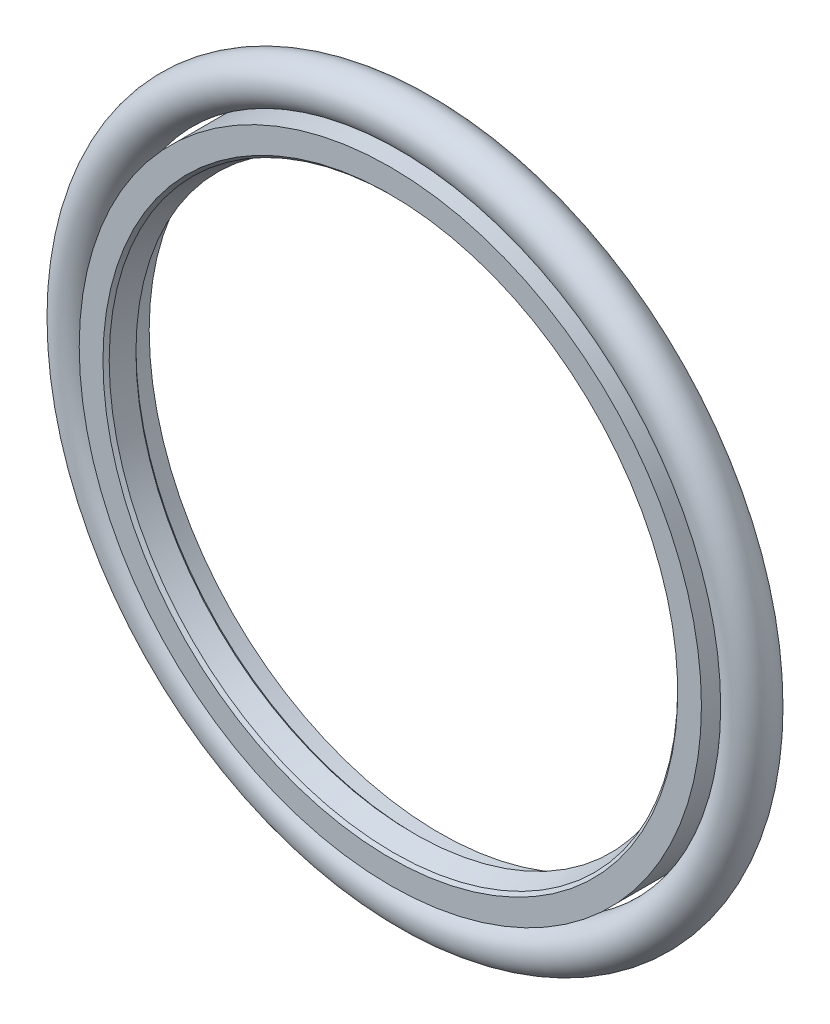
ISO-10303-21;
HEADER;
FILE_DESCRIPTION(('STEP AP214'),'2;1');
FILE_NAME('part.step','',(''),(''),'','','');
FILE_SCHEMA(('AUTOMOTIVE_DESIGN { 1 0 10303 214 1 1 1 1 }'));
ENDSEC;
DATA;
#1=APPLICATION_CONTEXT('core data for automotive mechanical design processes');
#2=APPLICATION_PROTOCOL_DEFINITION('international standard','automotive_design',2000,#1);
#3=PRODUCT_CONTEXT('',#1,'mechanical');
#4=PRODUCT('Part','Part','',(#3));
#5=PRODUCT_RELATED_PRODUCT_CATEGORY('part','',(#4));
#6=PRODUCT_DEFINITION_FORMATION('','',#4);
#7=PRODUCT_DEFINITION_CONTEXT('part definition',#1,'design');
#8=PRODUCT_DEFINITION('design','',#6,#7);
#9=PRODUCT_DEFINITION_SHAPE('','',#8);
#10=(LENGTH_UNIT() NAMED_UNIT(*) SI_UNIT(.MILLI.,.METRE.));
#11=(NAMED_UNIT(*) PLANE_ANGLE_UNIT() SI_UNIT($,.RADIAN.));
#12=(NAMED_UNIT(*) SI_UNIT($,.STERADIAN.) SOLID_ANGLE_UNIT());
#13=UNCERTAINTY_MEASURE_WITH_UNIT(LENGTH_MEASURE(1.E-05),#10,'distance_accuracy_value','');
#14=(GEOMETRIC_REPRESENTATION_CONTEXT(3) GLOBAL_UNCERTAINTY_ASSIGNED_CONTEXT((#13)) GLOBAL_UNIT_ASSIGNED_CONTEXT((#10,
#11,#12)) REPRESENTATION_CONTEXT('',''));
#15=CARTESIAN_POINT('',(0.,0.,0.));
#16=DIRECTION('',(0.,0.,1.));
#17=DIRECTION('',(1.,0.,0.));
#18=AXIS2_PLACEMENT_3D('',#15,#16,#17);
#19=CARTESIAN_POINT('',(0.,0.,1.975));
#20=DIRECTION('',(0.,0.,-1.));
#21=DIRECTION('',(-1.,0.,0.));
#22=AXIS2_PLACEMENT_3D('',#19,#20,#21);
#23=TOROIDAL_SURFACE('',#22,26.96,1.765);
#24=CARTESIAN_POINT('',(-28.725,0.,1.975));
#25=VERTEX_POINT('',#24);
#26=VERTEX_LOOP('',#25);
#27=FACE_BOUND('',#26,.T.);
#28=ADVANCED_FACE('F47',(#27),#23,.T.);
#29=CLOSED_SHELL('',(#28));
#30=MANIFOLD_SOLID_BREP('B2',#29);
#31=CARTESIAN_POINT('',(0.,0.,0.));
#32=DIRECTION('',(0.,0.,-1.));
#33=DIRECTION('',(-1.,0.,0.));
#34=AXIS2_PLACEMENT_3D('',#31,#32,#33);
#35=CYLINDRICAL_SURFACE('',#34,23.25);
#36=CARTESIAN_POINT('',(0.,0.,0.));
#37=DIRECTION('',(0.,0.,-1.));
#38=DIRECTION('',(-1.,0.,0.));
#39=AXIS2_PLACEMENT_3D('',#36,#37,#38);
#40=CIRCLE('',#39,23.25);
#41=CARTESIAN_POINT('',(-23.25,0.,0.));
#42=VERTEX_POINT('',#41);
#43=EDGE_CURVE('E93',#42,#42,#40,.T.);
#44=ORIENTED_EDGE('',*,*,#43,.T.);
#45=EDGE_LOOP('',(#44));
#46=FACE_BOUND('',#45,.T.);
#47=CARTESIAN_POINT('',(0.,0.,1.56));
#48=DIRECTION('',(0.,0.,-1.));
#49=DIRECTION('',(-1.,0.,0.));
#50=AXIS2_PLACEMENT_3D('',#47,#48,#49);
#51=CIRCLE('',#50,23.25);
#52=CARTESIAN_POINT('',(-23.25,0.,1.56));
#53=VERTEX_POINT('',#52);
#54=EDGE_CURVE('E46',#53,#53,#51,.T.);
#55=ORIENTED_EDGE('',*,*,#54,.F.);
#56=EDGE_LOOP('',(#55));
#57=FACE_BOUND('',#56,.T.);
#58=ADVANCED_FACE('F62',(#46,#57),#35,.F.);
#59=CARTESIAN_POINT('',(0.,0.,1.56));
#60=DIRECTION('',(0.,0.,-1.));
#61=DIRECTION('',(-1.,0.,0.));
#62=AXIS2_PLACEMENT_3D('',#59,#60,#61);
#63=TOROIDAL_SURFACE('',#62,23.,0.249999999999998);
#64=ORIENTED_EDGE('',*,*,#54,.T.);
#65=EDGE_LOOP('',(#64));
#66=FACE_BOUND('',#65,.T.);
#67=CARTESIAN_POINT('',(0.,0.,1.81));
#68=DIRECTION('',(0.,0.,-1.));
#69=DIRECTION('',(-1.,0.,0.));
#70=AXIS2_PLACEMENT_3D('',#67,#68,#69);
#71=CIRCLE('',#70,23.);
#72=CARTESIAN_POINT('',(-23.,0.,1.81));
#73=VERTEX_POINT('',#72);
#74=EDGE_CURVE('E68',#73,#73,#71,.T.);
#75=ORIENTED_EDGE('',*,*,#74,.F.);
#76=EDGE_LOOP('',(#75));
#77=FACE_BOUND('',#76,.T.);
#78=ADVANCED_FACE('F111',(#66,#77),#63,.F.);
#79=CARTESIAN_POINT('',(0.,22.5,1.81));
#80=DIRECTION('',(0.,0.,-1.));
#81=DIRECTION('',(-1.,0.,0.));
#82=AXIS2_PLACEMENT_3D('',#79,#80,#81);
#83=PLANE('',#82);
#84=ORIENTED_EDGE('',*,*,#74,.T.);
#85=EDGE_LOOP('',(#84));
#86=FACE_BOUND('',#85,.T.);
#87=CARTESIAN_POINT('',(0.,0.,1.81));
#88=DIRECTION('',(0.,0.,-1.));
#89=DIRECTION('',(-1.,0.,0.));
#90=AXIS2_PLACEMENT_3D('',#87,#88,#89);
#91=CIRCLE('',#90,22.5);
#92=CARTESIAN_POINT('',(-22.5,0.,1.81));
#93=VERTEX_POINT('',#92);
#94=EDGE_CURVE('E72',#93,#93,#91,.T.);
#95=ORIENTED_EDGE('',*,*,#94,.F.);
#96=EDGE_LOOP('',(#95));
#97=FACE_BOUND('',#96,.T.);
#98=ADVANCED_FACE('F115',(#86,#97),#83,.T.);
#99=CARTESIAN_POINT('',(0.,0.,2.06));
#100=DIRECTION('',(0.,0.,-1.));
#101=DIRECTION('',(-1.,0.,0.));
#102=AXIS2_PLACEMENT_3D('',#99,#100,#101);
#103=CONICAL_SURFACE('',#102,22.25,0.785398163397455);
#104=ORIENTED_EDGE('',*,*,#94,.T.);
#105=EDGE_LOOP('',(#104));
#106=FACE_BOUND('',#105,.T.);
#107=CARTESIAN_POINT('',(0.,0.,2.06));
#108=DIRECTION('',(0.,0.,-1.));
#109=DIRECTION('',(-1.,0.,0.));
#110=AXIS2_PLACEMENT_3D('',#107,#108,#109);
#111=CIRCLE('',#110,22.25);
#112=CARTESIAN_POINT('',(-22.25,0.,2.06));
#113=VERTEX_POINT('',#112);
#114=EDGE_CURVE('E76',#113,#113,#111,.T.);
#115=ORIENTED_EDGE('',*,*,#114,.F.);
#116=EDGE_LOOP('',(#115));
#117=FACE_BOUND('',#116,.T.);
#118=ADVANCED_FACE('F119',(#106,#117),#103,.F.);
#119=CARTESIAN_POINT('',(0.,0.,3.7));
#120=DIRECTION('',(0.,0.,1.));
#121=DIRECTION('',(1.,0.,0.));
#122=AXIS2_PLACEMENT_3D('',#119,#120,#121);
#123=CONICAL_SURFACE('',#122,22.7513983175922,0.29670597283903);
#124=ORIENTED_EDGE('',*,*,#114,.T.);
#125=EDGE_LOOP('',(#124));
#126=FACE_BOUND('',#125,.T.);
#127=CARTESIAN_POINT('',(0.,0.,3.7));
#128=DIRECTION('',(0.,0.,-1.));
#129=DIRECTION('',(-1.,0.,0.));
#130=AXIS2_PLACEMENT_3D('',#127,#128,#129);
#131=CIRCLE('',#130,22.7513983175922);
#132=CARTESIAN_POINT('',(-22.7513983175922,0.,3.7));
#133=VERTEX_POINT('',#132);
#134=EDGE_CURVE('E81',#133,#133,#131,.T.);
#135=ORIENTED_EDGE('',*,*,#134,.F.);
#136=EDGE_LOOP('',(#135));
#137=FACE_BOUND('',#136,.T.);
#138=ADVANCED_FACE('F125',(#126,#137),#123,.F.);
#139=CARTESIAN_POINT('',(0.,0.,3.95));
#140=DIRECTION('',(0.,0.,1.));
#141=DIRECTION('',(1.,0.,0.));
#142=AXIS2_PLACEMENT_3D('',#139,#140,#141);
#143=CONICAL_SURFACE('',#142,23.,0.782593692462877);
#144=ORIENTED_EDGE('',*,*,#134,.T.);
#145=EDGE_LOOP('',(#144));
#146=FACE_BOUND('',#145,.T.);
#147=CARTESIAN_POINT('',(0.,0.,3.95));
#148=DIRECTION('',(0.,0.,-1.));
#149=DIRECTION('',(-1.,0.,0.));
#150=AXIS2_PLACEMENT_3D('',#147,#148,#149);
#151=CIRCLE('',#150,23.);
#152=CARTESIAN_POINT('',(-23.,0.,3.95));
#153=VERTEX_POINT('',#152);
#154=EDGE_CURVE('E84',#153,#153,#151,.T.);
#155=ORIENTED_EDGE('',*,*,#154,.F.);
#156=EDGE_LOOP('',(#155));
#157=FACE_BOUND('',#156,.T.);
#158=ADVANCED_FACE('F129',(#146,#157),#143,.F.);
#159=CARTESIAN_POINT('',(0.,24.9,3.95));
#160=DIRECTION('',(0.,0.,1.));
#161=DIRECTION('',(1.,0.,0.));
#162=AXIS2_PLACEMENT_3D('',#159,#160,#161);
#163=PLANE('',#162);
#164=ORIENTED_EDGE('',*,*,#154,.T.);
#165=EDGE_LOOP('',(#164));
#166=FACE_BOUND('',#165,.T.);
#167=CARTESIAN_POINT('',(0.,0.,3.95));
#168=DIRECTION('',(0.,0.,-1.));
#169=DIRECTION('',(-1.,0.,0.));
#170=AXIS2_PLACEMENT_3D('',#167,#168,#169);
#171=CIRCLE('',#170,24.9);
#172=CARTESIAN_POINT('',(-24.9,0.,3.95));
#173=VERTEX_POINT('',#172);
#174=EDGE_CURVE('E87',#173,#173,#171,.T.);
#175=ORIENTED_EDGE('',*,*,#174,.F.);
#176=EDGE_LOOP('',(#175));
#177=FACE_BOUND('',#176,.T.);
#178=ADVANCED_FACE('F107',(#166,#177),#163,.T.);
#179=CARTESIAN_POINT('',(0.,0.,0.));
#180=DIRECTION('',(0.,0.,-1.));
#181=DIRECTION('',(-1.,0.,0.));
#182=AXIS2_PLACEMENT_3D('',#179,#180,#181);
#183=CYLINDRICAL_SURFACE('',#182,24.9);
#184=ORIENTED_EDGE('',*,*,#174,.T.);
#185=EDGE_LOOP('',(#184));
#186=FACE_BOUND('',#185,.T.);
#187=CARTESIAN_POINT('',(0.,0.,0.));
#188=DIRECTION('',(0.,0.,-1.));
#189=DIRECTION('',(-1.,0.,0.));
#190=AXIS2_PLACEMENT_3D('',#187,#188,#189);
#191=CIRCLE('',#190,24.9);
#192=CARTESIAN_POINT('',(-24.9,0.,0.));
#193=VERTEX_POINT('',#192);
#194=EDGE_CURVE('E90',#193,#193,#191,.T.);
#195=ORIENTED_EDGE('',*,*,#194,.F.);
#196=EDGE_LOOP('',(#195));
#197=FACE_BOUND('',#196,.T.);
#198=ADVANCED_FACE('F101',(#186,#197),#183,.T.);
#199=CARTESIAN_POINT('',(0.,23.25,0.));
#200=DIRECTION('',(0.,0.,-1.));
#201=DIRECTION('',(-1.,0.,0.));
#202=AXIS2_PLACEMENT_3D('',#199,#200,#201);
#203=PLANE('',#202);
#204=ORIENTED_EDGE('',*,*,#194,.T.);
#205=EDGE_LOOP('',(#204));
#206=FACE_BOUND('',#205,.T.);
#207=ORIENTED_EDGE('',*,*,#43,.F.);
#208=EDGE_LOOP('',(#207));
#209=FACE_BOUND('',#208,.T.);
#210=ADVANCED_FACE('F99',(#206,#209),#203,.T.);
#211=CLOSED_SHELL('',(#58,#78,#98,#118,#138,#158,#178,#198,#210));
#212=MANIFOLD_SOLID_BREP('B6',#211);
#213=ADVANCED_BREP_SHAPE_REPRESENTATION('',(#18,#30,#212),#14);
#214=SHAPE_DEFINITION_REPRESENTATION(#9,#213);
ENDSEC;
END-ISO-10303-21;
